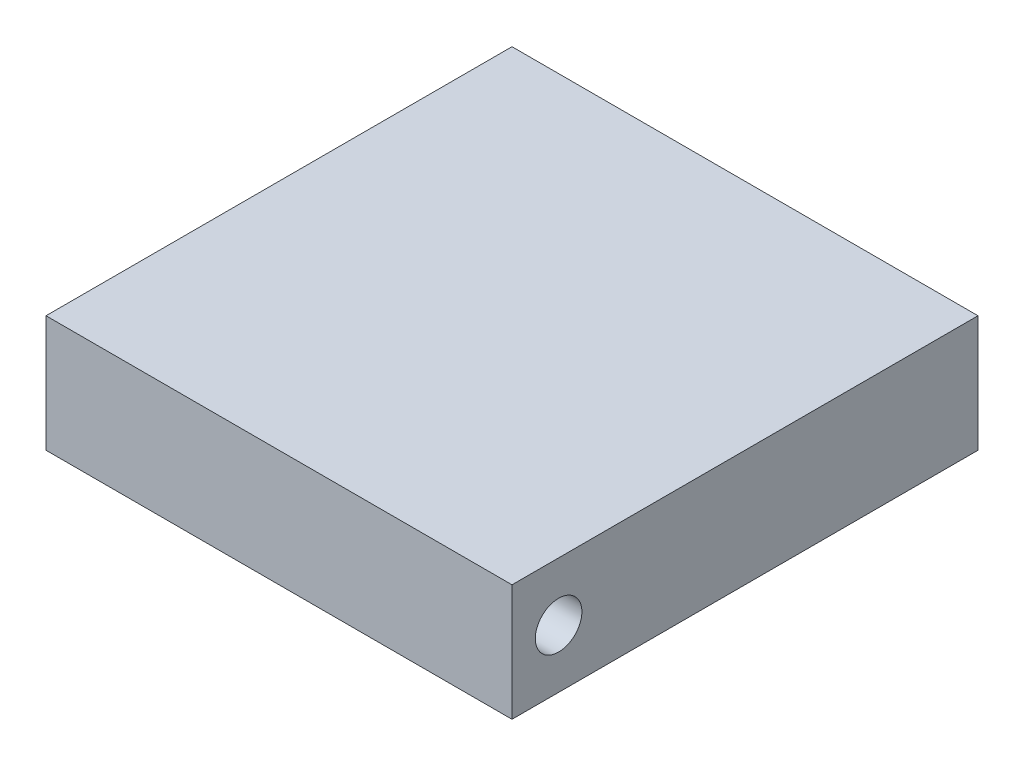
ISO-10303-21;
HEADER;
FILE_DESCRIPTION(('STEP AP214'),'2;1');
FILE_NAME('part.step','',(''),(''),'','','');
FILE_SCHEMA(('AUTOMOTIVE_DESIGN { 1 0 10303 214 1 1 1 1 }'));
ENDSEC;
DATA;
#1=APPLICATION_CONTEXT('core data for automotive mechanical design processes');
#2=APPLICATION_PROTOCOL_DEFINITION('international standard','automotive_design',2000,#1);
#3=PRODUCT_CONTEXT('',#1,'mechanical');
#4=PRODUCT('Part','Part','',(#3));
#5=PRODUCT_RELATED_PRODUCT_CATEGORY('part','',(#4));
#6=PRODUCT_DEFINITION_FORMATION('','',#4);
#7=PRODUCT_DEFINITION_CONTEXT('part definition',#1,'design');
#8=PRODUCT_DEFINITION('design','',#6,#7);
#9=PRODUCT_DEFINITION_SHAPE('','',#8);
#10=(LENGTH_UNIT() NAMED_UNIT(*) SI_UNIT(.MILLI.,.METRE.));
#11=(NAMED_UNIT(*) PLANE_ANGLE_UNIT() SI_UNIT($,.RADIAN.));
#12=(NAMED_UNIT(*) SI_UNIT($,.STERADIAN.) SOLID_ANGLE_UNIT());
#13=UNCERTAINTY_MEASURE_WITH_UNIT(LENGTH_MEASURE(1.E-05),#10,'distance_accuracy_value','');
#14=(GEOMETRIC_REPRESENTATION_CONTEXT(3) GLOBAL_UNCERTAINTY_ASSIGNED_CONTEXT((#13)) GLOBAL_UNIT_ASSIGNED_CONTEXT((#10,
#11,#12)) REPRESENTATION_CONTEXT('',''));
#15=CARTESIAN_POINT('',(0.,0.,0.));
#16=DIRECTION('',(0.,0.,1.));
#17=DIRECTION('',(1.,0.,0.));
#18=AXIS2_PLACEMENT_3D('',#15,#16,#17);
#19=CARTESIAN_POINT('',(10.,2.5,-10.));
#20=DIRECTION('',(-1.,0.,0.));
#21=DIRECTION('',(0.,0.,1.));
#22=AXIS2_PLACEMENT_3D('',#19,#20,#21);
#23=PLANE('',#22);
#24=CARTESIAN_POINT('',(10.,0.,8.00000000000001));
#25=DIRECTION('',(1.,0.,0.));
#26=DIRECTION('',(0.,0.,-1.));
#27=AXIS2_PLACEMENT_3D('',#24,#25,#26);
#28=CIRCLE('',#27,1.);
#29=CARTESIAN_POINT('',(10.,0.,7.00000000000001));
#30=VERTEX_POINT('',#29);
#31=EDGE_CURVE('E112',#30,#30,#28,.T.);
#32=ORIENTED_EDGE('',*,*,#31,.F.);
#33=EDGE_LOOP('',(#32));
#34=FACE_BOUND('',#33,.T.);
#35=DIRECTION('',(0.,0.,-1.));
#36=VECTOR('',#35,1.);
#37=CARTESIAN_POINT('',(10.,-2.5,-10.));
#38=LINE('',#37,#36);
#39=CARTESIAN_POINT('',(10.,-2.5,10.));
#40=VERTEX_POINT('',#39);
#41=CARTESIAN_POINT('',(10.,-2.5,-10.));
#42=VERTEX_POINT('',#41);
#43=EDGE_CURVE('E96',#40,#42,#38,.T.);
#44=ORIENTED_EDGE('',*,*,#43,.T.);
#45=DIRECTION('',(0.,-1.,0.));
#46=VECTOR('',#45,1.);
#47=CARTESIAN_POINT('',(10.,2.5,-10.));
#48=LINE('',#47,#46);
#49=CARTESIAN_POINT('',(10.,2.5,-10.));
#50=VERTEX_POINT('',#49);
#51=EDGE_CURVE('E11',#50,#42,#48,.T.);
#52=ORIENTED_EDGE('',*,*,#51,.F.);
#53=DIRECTION('',(0.,0.,-1.));
#54=VECTOR('',#53,1.);
#55=CARTESIAN_POINT('',(10.,2.5,-10.));
#56=LINE('',#55,#54);
#57=CARTESIAN_POINT('',(10.,2.5,10.));
#58=VERTEX_POINT('',#57);
#59=EDGE_CURVE('E84',#58,#50,#56,.T.);
#60=ORIENTED_EDGE('',*,*,#59,.F.);
#61=DIRECTION('',(0.,-1.,0.));
#62=VECTOR('',#61,1.);
#63=CARTESIAN_POINT('',(10.,2.5,10.));
#64=LINE('',#63,#62);
#65=EDGE_CURVE('E92',#58,#40,#64,.T.);
#66=ORIENTED_EDGE('',*,*,#65,.T.);
#67=EDGE_LOOP('',(#44,#52,#60,#66));
#68=FACE_BOUND('',#67,.T.);
#69=ADVANCED_FACE('F33',(#34,#68),#23,.F.);
#70=CARTESIAN_POINT('',(-10.,2.5,-10.));
#71=DIRECTION('',(0.,0.,1.));
#72=DIRECTION('',(1.,0.,0.));
#73=AXIS2_PLACEMENT_3D('',#70,#71,#72);
#74=PLANE('',#73);
#75=DIRECTION('',(-1.,0.,0.));
#76=VECTOR('',#75,1.);
#77=CARTESIAN_POINT('',(-10.,-2.5,-10.));
#78=LINE('',#77,#76);
#79=CARTESIAN_POINT('',(-10.,-2.5,-10.));
#80=VERTEX_POINT('',#79);
#81=EDGE_CURVE('E88',#42,#80,#78,.T.);
#82=ORIENTED_EDGE('',*,*,#81,.T.);
#83=DIRECTION('',(0.,-1.,0.));
#84=VECTOR('',#83,1.);
#85=CARTESIAN_POINT('',(-10.,2.5,-10.));
#86=LINE('',#85,#84);
#87=CARTESIAN_POINT('',(-10.,2.5,-10.));
#88=VERTEX_POINT('',#87);
#89=EDGE_CURVE('E41',#88,#80,#86,.T.);
#90=ORIENTED_EDGE('',*,*,#89,.F.);
#91=DIRECTION('',(-1.,0.,0.));
#92=VECTOR('',#91,1.);
#93=CARTESIAN_POINT('',(-10.,2.5,-10.));
#94=LINE('',#93,#92);
#95=EDGE_CURVE('E79',#50,#88,#94,.T.);
#96=ORIENTED_EDGE('',*,*,#95,.F.);
#97=ORIENTED_EDGE('',*,*,#51,.T.);
#98=EDGE_LOOP('',(#82,#90,#96,#97));
#99=FACE_BOUND('',#98,.T.);
#100=ADVANCED_FACE('F87',(#99),#74,.F.);
#101=CARTESIAN_POINT('',(-10.,2.5,-10.));
#102=DIRECTION('',(1.,0.,0.));
#103=DIRECTION('',(0.,0.,-1.));
#104=AXIS2_PLACEMENT_3D('',#101,#102,#103);
#105=PLANE('',#104);
#106=CARTESIAN_POINT('',(-10.,0.,8.00000000000001));
#107=DIRECTION('',(1.,0.,0.));
#108=DIRECTION('',(0.,0.,-1.));
#109=AXIS2_PLACEMENT_3D('',#106,#107,#108);
#110=CIRCLE('',#109,1.);
#111=CARTESIAN_POINT('',(-10.,0.,7.00000000000001));
#112=VERTEX_POINT('',#111);
#113=EDGE_CURVE('E99',#112,#112,#110,.F.);
#114=ORIENTED_EDGE('',*,*,#113,.F.);
#115=EDGE_LOOP('',(#114));
#116=FACE_BOUND('',#115,.T.);
#117=DIRECTION('',(0.,0.,1.));
#118=VECTOR('',#117,1.);
#119=CARTESIAN_POINT('',(-10.,-2.5,-10.));
#120=LINE('',#119,#118);
#121=CARTESIAN_POINT('',(-10.,-2.5,10.));
#122=VERTEX_POINT('',#121);
#123=EDGE_CURVE('E66',#80,#122,#120,.T.);
#124=ORIENTED_EDGE('',*,*,#123,.T.);
#125=DIRECTION('',(0.,-1.,0.));
#126=VECTOR('',#125,1.);
#127=CARTESIAN_POINT('',(-10.,2.5,10.));
#128=LINE('',#127,#126);
#129=CARTESIAN_POINT('',(-10.,2.5,10.));
#130=VERTEX_POINT('',#129);
#131=EDGE_CURVE('E89',#130,#122,#128,.T.);
#132=ORIENTED_EDGE('',*,*,#131,.F.);
#133=DIRECTION('',(0.,0.,1.));
#134=VECTOR('',#133,1.);
#135=CARTESIAN_POINT('',(-10.,2.5,-10.));
#136=LINE('',#135,#134);
#137=EDGE_CURVE('E82',#88,#130,#136,.T.);
#138=ORIENTED_EDGE('',*,*,#137,.F.);
#139=ORIENTED_EDGE('',*,*,#89,.T.);
#140=EDGE_LOOP('',(#124,#132,#138,#139));
#141=FACE_BOUND('',#140,.T.);
#142=ADVANCED_FACE('F90',(#116,#141),#105,.F.);
#143=CARTESIAN_POINT('',(-10.,2.5,10.));
#144=DIRECTION('',(0.,0.,-1.));
#145=DIRECTION('',(-1.,0.,0.));
#146=AXIS2_PLACEMENT_3D('',#143,#144,#145);
#147=PLANE('',#146);
#148=DIRECTION('',(1.,0.,0.));
#149=VECTOR('',#148,1.);
#150=CARTESIAN_POINT('',(-10.,-2.5,10.));
#151=LINE('',#150,#149);
#152=EDGE_CURVE('E72',#122,#40,#151,.T.);
#153=ORIENTED_EDGE('',*,*,#152,.T.);
#154=ORIENTED_EDGE('',*,*,#65,.F.);
#155=DIRECTION('',(1.,0.,0.));
#156=VECTOR('',#155,1.);
#157=CARTESIAN_POINT('',(-10.,2.5,10.));
#158=LINE('',#157,#156);
#159=EDGE_CURVE('E49',#130,#58,#158,.T.);
#160=ORIENTED_EDGE('',*,*,#159,.F.);
#161=ORIENTED_EDGE('',*,*,#131,.T.);
#162=EDGE_LOOP('',(#153,#154,#160,#161));
#163=FACE_BOUND('',#162,.T.);
#164=ADVANCED_FACE('F104',(#163),#147,.F.);
#165=CARTESIAN_POINT('',(0.,2.5,0.));
#166=DIRECTION('',(0.,1.,0.));
#167=DIRECTION('',(0.,0.,1.));
#168=AXIS2_PLACEMENT_3D('',#165,#166,#167);
#169=PLANE('',#168);
#170=ORIENTED_EDGE('',*,*,#59,.T.);
#171=ORIENTED_EDGE('',*,*,#95,.T.);
#172=ORIENTED_EDGE('',*,*,#137,.T.);
#173=ORIENTED_EDGE('',*,*,#159,.T.);
#174=EDGE_LOOP('',(#170,#171,#172,#173));
#175=FACE_BOUND('',#174,.T.);
#176=ADVANCED_FACE('F80',(#175),#169,.T.);
#177=CARTESIAN_POINT('',(0.,-2.5,0.));
#178=DIRECTION('',(0.,1.,0.));
#179=DIRECTION('',(0.,0.,1.));
#180=AXIS2_PLACEMENT_3D('',#177,#178,#179);
#181=PLANE('',#180);
#182=ORIENTED_EDGE('',*,*,#43,.F.);
#183=ORIENTED_EDGE('',*,*,#152,.F.);
#184=ORIENTED_EDGE('',*,*,#123,.F.);
#185=ORIENTED_EDGE('',*,*,#81,.F.);
#186=EDGE_LOOP('',(#182,#183,#184,#185));
#187=FACE_BOUND('',#186,.T.);
#188=ADVANCED_FACE('F107',(#187),#181,.F.);
#189=CARTESIAN_POINT('',(-10.001,0.,8.00000000000001));
#190=DIRECTION('',(1.,0.,0.));
#191=DIRECTION('',(0.,0.,-1.));
#192=AXIS2_PLACEMENT_3D('',#189,#190,#191);
#193=CYLINDRICAL_SURFACE('',#192,1.);
#194=ORIENTED_EDGE('',*,*,#31,.T.);
#195=EDGE_LOOP('',(#194));
#196=FACE_BOUND('',#195,.T.);
#197=ORIENTED_EDGE('',*,*,#113,.T.);
#198=EDGE_LOOP('',(#197));
#199=FACE_BOUND('',#198,.T.);
#200=ADVANCED_FACE('F116',(#196,#199),#193,.F.);
#201=CLOSED_SHELL('',(#69,#100,#142,#164,#176,#188,#200));
#202=MANIFOLD_SOLID_BREP('B2',#201);
#203=ADVANCED_BREP_SHAPE_REPRESENTATION('',(#18,#202),#14);
#204=SHAPE_DEFINITION_REPRESENTATION(#9,#203);
ENDSEC;
END-ISO-10303-21;
